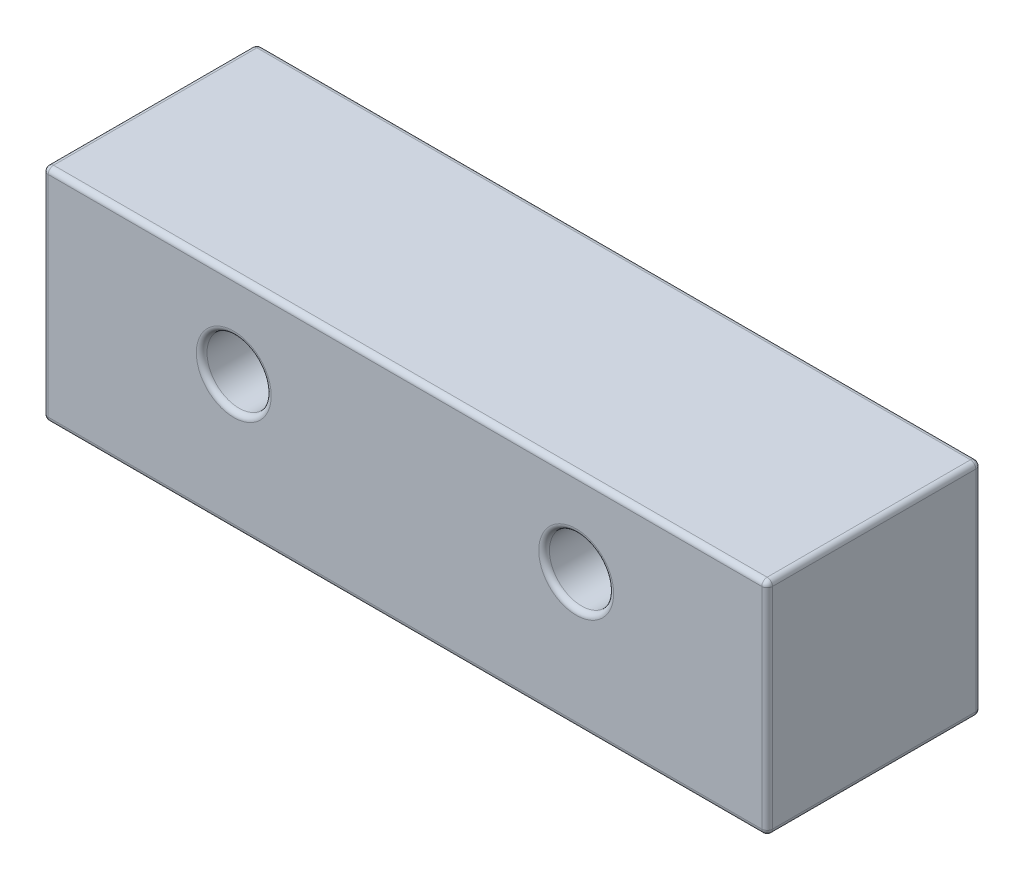
ISO-10303-21;
HEADER;
FILE_DESCRIPTION(('STEP AP214'),'2;1');
FILE_NAME('part.step','',(''),(''),'','','');
FILE_SCHEMA(('AUTOMOTIVE_DESIGN { 1 0 10303 214 1 1 1 1 }'));
ENDSEC;
DATA;
#1=APPLICATION_CONTEXT('core data for automotive mechanical design processes');
#2=APPLICATION_PROTOCOL_DEFINITION('international standard','automotive_design',2000,#1);
#3=PRODUCT_CONTEXT('',#1,'mechanical');
#4=PRODUCT('Part','Part','',(#3));
#5=PRODUCT_RELATED_PRODUCT_CATEGORY('part','',(#4));
#6=PRODUCT_DEFINITION_FORMATION('','',#4);
#7=PRODUCT_DEFINITION_CONTEXT('part definition',#1,'design');
#8=PRODUCT_DEFINITION('design','',#6,#7);
#9=PRODUCT_DEFINITION_SHAPE('','',#8);
#10=(LENGTH_UNIT() NAMED_UNIT(*) SI_UNIT(.MILLI.,.METRE.));
#11=(NAMED_UNIT(*) PLANE_ANGLE_UNIT() SI_UNIT($,.RADIAN.));
#12=(NAMED_UNIT(*) SI_UNIT($,.STERADIAN.) SOLID_ANGLE_UNIT());
#13=UNCERTAINTY_MEASURE_WITH_UNIT(LENGTH_MEASURE(1.E-05),#10,'distance_accuracy_value','');
#14=(GEOMETRIC_REPRESENTATION_CONTEXT(3) GLOBAL_UNCERTAINTY_ASSIGNED_CONTEXT((#13)) GLOBAL_UNIT_ASSIGNED_CONTEXT((#10,
#11,#12)) REPRESENTATION_CONTEXT('',''));
#15=CARTESIAN_POINT('',(0.,0.,0.));
#16=DIRECTION('',(0.,0.,1.));
#17=DIRECTION('',(1.,0.,0.));
#18=AXIS2_PLACEMENT_3D('',#15,#16,#17);
#19=CARTESIAN_POINT('',(0.,0.,20.));
#20=DIRECTION('',(0.,0.,-1.));
#21=DIRECTION('',(-1.,0.,0.));
#22=AXIS2_PLACEMENT_3D('',#19,#20,#21);
#23=PLANE('',#22);
#24=CARTESIAN_POINT('',(-17.8421373977874,12.6355262772669,20.));
#25=DIRECTION('',(0.,0.,-1.));
#26=DIRECTION('',(-1.,0.,0.));
#27=AXIS2_PLACEMENT_3D('',#24,#25,#26);
#28=CIRCLE('',#27,3.5);
#29=CARTESIAN_POINT('',(-21.3421373977874,12.6355262772669,20.));
#30=VERTEX_POINT('',#29);
#31=EDGE_CURVE('E220',#30,#30,#28,.T.);
#32=ORIENTED_EDGE('',*,*,#31,.T.);
#33=EDGE_LOOP('',(#32));
#34=FACE_BOUND('',#33,.T.);
#35=CARTESIAN_POINT('',(-49.8421373977874,12.6355262772669,20.));
#36=DIRECTION('',(0.,0.,-1.));
#37=DIRECTION('',(-1.,0.,0.));
#38=AXIS2_PLACEMENT_3D('',#35,#36,#37);
#39=CIRCLE('',#38,3.49999999999999);
#40=CARTESIAN_POINT('',(-53.3421373977874,12.6355262772669,20.));
#41=VERTEX_POINT('',#40);
#42=EDGE_CURVE('E217',#41,#41,#39,.T.);
#43=ORIENTED_EDGE('',*,*,#42,.T.);
#44=EDGE_LOOP('',(#43));
#45=FACE_BOUND('',#44,.T.);
#46=DIRECTION('',(0.,-1.,0.));
#47=VECTOR('',#46,1.);
#48=CARTESIAN_POINT('',(-67.1842747955748,0.,20.));
#49=LINE('',#48,#47);
#50=CARTESIAN_POINT('',(-67.1842747955748,20.1355262772669,20.));
#51=VERTEX_POINT('',#50);
#52=CARTESIAN_POINT('',(-67.1842747955748,0.5,20.));
#53=VERTEX_POINT('',#52);
#54=EDGE_CURVE('E212',#51,#53,#49,.T.);
#55=ORIENTED_EDGE('',*,*,#54,.T.);
#56=DIRECTION('',(1.,0.,0.));
#57=VECTOR('',#56,1.);
#58=CARTESIAN_POINT('',(0.,0.5,20.));
#59=LINE('',#58,#57);
#60=CARTESIAN_POINT('',(-0.5,0.5,20.));
#61=VERTEX_POINT('',#60);
#62=EDGE_CURVE('E215',#53,#61,#59,.T.);
#63=ORIENTED_EDGE('',*,*,#62,.T.);
#64=DIRECTION('',(0.,1.,0.));
#65=VECTOR('',#64,1.);
#66=CARTESIAN_POINT('',(-0.5,0.,20.));
#67=LINE('',#66,#65);
#68=CARTESIAN_POINT('',(-0.5,20.1355262772669,20.));
#69=VERTEX_POINT('',#68);
#70=EDGE_CURVE('E210',#61,#69,#67,.T.);
#71=ORIENTED_EDGE('',*,*,#70,.T.);
#72=DIRECTION('',(-1.,0.,0.));
#73=VECTOR('',#72,1.);
#74=CARTESIAN_POINT('',(0.,20.1355262772669,20.));
#75=LINE('',#74,#73);
#76=EDGE_CURVE('E208',#69,#51,#75,.T.);
#77=ORIENTED_EDGE('',*,*,#76,.T.);
#78=EDGE_LOOP('',(#55,#63,#71,#77));
#79=FACE_BOUND('',#78,.T.);
#80=ADVANCED_FACE('F33',(#34,#45,#79),#23,.F.);
#81=CARTESIAN_POINT('',(0.,0.,0.));
#82=DIRECTION('',(0.,0.,-1.));
#83=DIRECTION('',(-1.,0.,0.));
#84=AXIS2_PLACEMENT_3D('',#81,#82,#83);
#85=PLANE('',#84);
#86=CARTESIAN_POINT('',(-17.8421373977874,12.6355262772669,0.));
#87=DIRECTION('',(0.,0.,-1.));
#88=DIRECTION('',(-1.,0.,0.));
#89=AXIS2_PLACEMENT_3D('',#86,#87,#88);
#90=CIRCLE('',#89,3.5);
#91=CARTESIAN_POINT('',(-21.3421373977874,12.6355262772669,0.));
#92=VERTEX_POINT('',#91);
#93=EDGE_CURVE('E168',#92,#92,#90,.F.);
#94=ORIENTED_EDGE('',*,*,#93,.T.);
#95=EDGE_LOOP('',(#94));
#96=FACE_BOUND('',#95,.T.);
#97=CARTESIAN_POINT('',(-49.8421373977874,12.6355262772669,0.));
#98=DIRECTION('',(0.,0.,-1.));
#99=DIRECTION('',(-1.,0.,0.));
#100=AXIS2_PLACEMENT_3D('',#97,#98,#99);
#101=CIRCLE('',#100,3.49999999999999);
#102=CARTESIAN_POINT('',(-53.3421373977874,12.6355262772669,0.));
#103=VERTEX_POINT('',#102);
#104=EDGE_CURVE('E165',#103,#103,#101,.F.);
#105=ORIENTED_EDGE('',*,*,#104,.T.);
#106=EDGE_LOOP('',(#105));
#107=FACE_BOUND('',#106,.T.);
#108=DIRECTION('',(0.,1.,0.));
#109=VECTOR('',#108,1.);
#110=CARTESIAN_POINT('',(-0.5,0.,0.));
#111=LINE('',#110,#109);
#112=CARTESIAN_POINT('',(-0.5,20.1355262772669,0.));
#113=VERTEX_POINT('',#112);
#114=CARTESIAN_POINT('',(-0.5,0.5,0.));
#115=VERTEX_POINT('',#114);
#116=EDGE_CURVE('E133',#113,#115,#111,.F.);
#117=ORIENTED_EDGE('',*,*,#116,.T.);
#118=DIRECTION('',(1.,0.,0.));
#119=VECTOR('',#118,1.);
#120=CARTESIAN_POINT('',(-67.6842747955748,0.5,0.));
#121=LINE('',#120,#119);
#122=CARTESIAN_POINT('',(-67.1842747955748,0.5,0.));
#123=VERTEX_POINT('',#122);
#124=EDGE_CURVE('E129',#115,#123,#121,.F.);
#125=ORIENTED_EDGE('',*,*,#124,.T.);
#126=DIRECTION('',(0.,-1.,0.));
#127=VECTOR('',#126,1.);
#128=CARTESIAN_POINT('',(-67.1842747955748,20.6355262772669,0.));
#129=LINE('',#128,#127);
#130=CARTESIAN_POINT('',(-67.1842747955748,20.1355262772669,0.));
#131=VERTEX_POINT('',#130);
#132=EDGE_CURVE('E121',#123,#131,#129,.F.);
#133=ORIENTED_EDGE('',*,*,#132,.T.);
#134=DIRECTION('',(-1.,0.,0.));
#135=VECTOR('',#134,1.);
#136=CARTESIAN_POINT('',(0.,20.1355262772669,0.));
#137=LINE('',#136,#135);
#138=EDGE_CURVE('E126',#131,#113,#137,.F.);
#139=ORIENTED_EDGE('',*,*,#138,.T.);
#140=EDGE_LOOP('',(#117,#125,#133,#139));
#141=FACE_BOUND('',#140,.T.);
#142=ADVANCED_FACE('F124',(#96,#107,#141),#85,.T.);
#143=CARTESIAN_POINT('',(-67.6842747955748,0.,20.));
#144=DIRECTION('',(0.,1.,0.));
#145=DIRECTION('',(0.,0.,1.));
#146=AXIS2_PLACEMENT_3D('',#143,#144,#145);
#147=PLANE('',#146);
#148=DIRECTION('',(0.,0.,-1.));
#149=VECTOR('',#148,1.);
#150=CARTESIAN_POINT('',(-67.1842747955748,0.,20.));
#151=LINE('',#150,#149);
#152=CARTESIAN_POINT('',(-67.1842747955748,0.,19.5));
#153=VERTEX_POINT('',#152);
#154=CARTESIAN_POINT('',(-67.1842747955748,0.,0.5));
#155=VERTEX_POINT('',#154);
#156=EDGE_CURVE('E203',#153,#155,#151,.T.);
#157=ORIENTED_EDGE('',*,*,#156,.T.);
#158=DIRECTION('',(1.,0.,0.));
#159=VECTOR('',#158,1.);
#160=CARTESIAN_POINT('',(0.,0.,0.5));
#161=LINE('',#160,#159);
#162=CARTESIAN_POINT('',(-0.5,0.,0.5));
#163=VERTEX_POINT('',#162);
#164=EDGE_CURVE('E206',#155,#163,#161,.T.);
#165=ORIENTED_EDGE('',*,*,#164,.T.);
#166=DIRECTION('',(0.,0.,-1.));
#167=VECTOR('',#166,1.);
#168=CARTESIAN_POINT('',(-0.5,0.,20.));
#169=LINE('',#168,#167);
#170=CARTESIAN_POINT('',(-0.5,0.,19.5));
#171=VERTEX_POINT('',#170);
#172=EDGE_CURVE('E201',#163,#171,#169,.F.);
#173=ORIENTED_EDGE('',*,*,#172,.T.);
#174=DIRECTION('',(1.,0.,0.));
#175=VECTOR('',#174,1.);
#176=CARTESIAN_POINT('',(-67.6842747955748,0.,19.5));
#177=LINE('',#176,#175);
#178=EDGE_CURVE('E199',#171,#153,#177,.F.);
#179=ORIENTED_EDGE('',*,*,#178,.T.);
#180=EDGE_LOOP('',(#157,#165,#173,#179));
#181=FACE_BOUND('',#180,.T.);
#182=ADVANCED_FACE('F313',(#181),#147,.F.);
#183=CARTESIAN_POINT('',(0.,20.6355262772669,20.));
#184=DIRECTION('',(-1.,0.,0.));
#185=DIRECTION('',(0.,0.,1.));
#186=AXIS2_PLACEMENT_3D('',#183,#184,#185);
#187=PLANE('',#186);
#188=DIRECTION('',(0.,0.,-1.));
#189=VECTOR('',#188,1.);
#190=CARTESIAN_POINT('',(0.,0.5,20.));
#191=LINE('',#190,#189);
#192=CARTESIAN_POINT('',(0.,0.5,19.5));
#193=VERTEX_POINT('',#192);
#194=CARTESIAN_POINT('',(0.,0.5,0.5));
#195=VERTEX_POINT('',#194);
#196=EDGE_CURVE('E181',#193,#195,#191,.T.);
#197=ORIENTED_EDGE('',*,*,#196,.T.);
#198=DIRECTION('',(0.,1.,0.));
#199=VECTOR('',#198,1.);
#200=CARTESIAN_POINT('',(0.,20.6355262772669,0.5));
#201=LINE('',#200,#199);
#202=CARTESIAN_POINT('',(0.,20.1355262772669,0.5));
#203=VERTEX_POINT('',#202);
#204=EDGE_CURVE('E183',#195,#203,#201,.T.);
#205=ORIENTED_EDGE('',*,*,#204,.T.);
#206=DIRECTION('',(0.,0.,-1.));
#207=VECTOR('',#206,1.);
#208=CARTESIAN_POINT('',(0.,20.1355262772669,20.));
#209=LINE('',#208,#207);
#210=CARTESIAN_POINT('',(0.,20.1355262772669,19.5));
#211=VERTEX_POINT('',#210);
#212=EDGE_CURVE('E177',#203,#211,#209,.F.);
#213=ORIENTED_EDGE('',*,*,#212,.T.);
#214=DIRECTION('',(0.,1.,0.));
#215=VECTOR('',#214,1.);
#216=CARTESIAN_POINT('',(0.,20.6355262772669,19.5));
#217=LINE('',#216,#215);
#218=EDGE_CURVE('E179',#211,#193,#217,.F.);
#219=ORIENTED_EDGE('',*,*,#218,.T.);
#220=EDGE_LOOP('',(#197,#205,#213,#219));
#221=FACE_BOUND('',#220,.T.);
#222=ADVANCED_FACE('F327',(#221),#187,.F.);
#223=CARTESIAN_POINT('',(0.,20.6355262772669,20.));
#224=DIRECTION('',(0.,-1.,0.));
#225=DIRECTION('',(1.,0.,0.));
#226=AXIS2_PLACEMENT_3D('',#223,#224,#225);
#227=PLANE('',#226);
#228=DIRECTION('',(-1.,0.,0.));
#229=VECTOR('',#228,1.);
#230=CARTESIAN_POINT('',(0.,20.6355262772669,19.5));
#231=LINE('',#230,#229);
#232=CARTESIAN_POINT('',(-67.1842747955748,20.6355262772669,19.5));
#233=VERTEX_POINT('',#232);
#234=CARTESIAN_POINT('',(-0.5,20.6355262772669,19.5));
#235=VERTEX_POINT('',#234);
#236=EDGE_CURVE('E42',#233,#235,#231,.F.);
#237=ORIENTED_EDGE('',*,*,#236,.T.);
#238=DIRECTION('',(0.,0.,-1.));
#239=VECTOR('',#238,1.);
#240=CARTESIAN_POINT('',(-0.5,20.6355262772669,20.));
#241=LINE('',#240,#239);
#242=CARTESIAN_POINT('',(-0.5,20.6355262772669,0.5));
#243=VERTEX_POINT('',#242);
#244=EDGE_CURVE('E11',#235,#243,#241,.T.);
#245=ORIENTED_EDGE('',*,*,#244,.T.);
#246=DIRECTION('',(-1.,0.,0.));
#247=VECTOR('',#246,1.);
#248=CARTESIAN_POINT('',(-67.6842747955748,20.6355262772669,0.5));
#249=LINE('',#248,#247);
#250=CARTESIAN_POINT('',(-67.1842747955748,20.6355262772669,0.5));
#251=VERTEX_POINT('',#250);
#252=EDGE_CURVE('E223',#243,#251,#249,.T.);
#253=ORIENTED_EDGE('',*,*,#252,.T.);
#254=DIRECTION('',(0.,0.,-1.));
#255=VECTOR('',#254,1.);
#256=CARTESIAN_POINT('',(-67.1842747955748,20.6355262772669,20.));
#257=LINE('',#256,#255);
#258=EDGE_CURVE('E53',#251,#233,#257,.F.);
#259=ORIENTED_EDGE('',*,*,#258,.T.);
#260=EDGE_LOOP('',(#237,#245,#253,#259));
#261=FACE_BOUND('',#260,.T.);
#262=ADVANCED_FACE('F296',(#261),#227,.F.);
#263=CARTESIAN_POINT('',(-67.6842747955748,20.6355262772669,20.));
#264=DIRECTION('',(1.,0.,0.));
#265=DIRECTION('',(0.,0.,-1.));
#266=AXIS2_PLACEMENT_3D('',#263,#264,#265);
#267=PLANE('',#266);
#268=DIRECTION('',(0.,0.,-1.));
#269=VECTOR('',#268,1.);
#270=CARTESIAN_POINT('',(-67.6842747955748,20.1355262772669,20.));
#271=LINE('',#270,#269);
#272=CARTESIAN_POINT('',(-67.6842747955748,20.1355262772669,19.5));
#273=VERTEX_POINT('',#272);
#274=CARTESIAN_POINT('',(-67.6842747955748,20.1355262772669,0.5));
#275=VERTEX_POINT('',#274);
#276=EDGE_CURVE('E186',#273,#275,#271,.T.);
#277=ORIENTED_EDGE('',*,*,#276,.T.);
#278=DIRECTION('',(0.,-1.,0.));
#279=VECTOR('',#278,1.);
#280=CARTESIAN_POINT('',(-67.6842747955748,0.,0.5));
#281=LINE('',#280,#279);
#282=CARTESIAN_POINT('',(-67.6842747955748,0.5,0.5));
#283=VERTEX_POINT('',#282);
#284=EDGE_CURVE('E141',#275,#283,#281,.T.);
#285=ORIENTED_EDGE('',*,*,#284,.T.);
#286=DIRECTION('',(0.,0.,-1.));
#287=VECTOR('',#286,1.);
#288=CARTESIAN_POINT('',(-67.6842747955748,0.5,20.));
#289=LINE('',#288,#287);
#290=CARTESIAN_POINT('',(-67.6842747955748,0.5,19.5));
#291=VERTEX_POINT('',#290);
#292=EDGE_CURVE('E190',#283,#291,#289,.F.);
#293=ORIENTED_EDGE('',*,*,#292,.T.);
#294=DIRECTION('',(0.,-1.,0.));
#295=VECTOR('',#294,1.);
#296=CARTESIAN_POINT('',(-67.6842747955748,20.6355262772669,19.5));
#297=LINE('',#296,#295);
#298=EDGE_CURVE('E188',#291,#273,#297,.F.);
#299=ORIENTED_EDGE('',*,*,#298,.T.);
#300=EDGE_LOOP('',(#277,#285,#293,#299));
#301=FACE_BOUND('',#300,.T.);
#302=ADVANCED_FACE('F300',(#301),#267,.F.);
#303=CARTESIAN_POINT('',(-49.8421373977874,12.6355262772669,20.));
#304=DIRECTION('',(0.,0.,-1.));
#305=DIRECTION('',(-1.,0.,0.));
#306=AXIS2_PLACEMENT_3D('',#303,#304,#305);
#307=CYLINDRICAL_SURFACE('',#306,2.99999999999999);
#308=CARTESIAN_POINT('',(-49.8421373977874,12.6355262772669,0.5));
#309=DIRECTION('',(0.,0.,-1.));
#310=DIRECTION('',(-1.,0.,0.));
#311=AXIS2_PLACEMENT_3D('',#308,#309,#310);
#312=CIRCLE('',#311,2.99999999999999);
#313=CARTESIAN_POINT('',(-52.8421373977874,12.6355262772669,0.5));
#314=VERTEX_POINT('',#313);
#315=EDGE_CURVE('E196',#314,#314,#312,.T.);
#316=ORIENTED_EDGE('',*,*,#315,.T.);
#317=EDGE_LOOP('',(#316));
#318=FACE_BOUND('',#317,.T.);
#319=CARTESIAN_POINT('',(-49.8421373977874,12.6355262772669,19.5));
#320=DIRECTION('',(0.,0.,-1.));
#321=DIRECTION('',(-1.,0.,0.));
#322=AXIS2_PLACEMENT_3D('',#319,#320,#321);
#323=CIRCLE('',#322,2.99999999999999);
#324=CARTESIAN_POINT('',(-52.8421373977874,12.6355262772669,19.5));
#325=VERTEX_POINT('',#324);
#326=EDGE_CURVE('E193',#325,#325,#323,.F.);
#327=ORIENTED_EDGE('',*,*,#326,.T.);
#328=EDGE_LOOP('',(#327));
#329=FACE_BOUND('',#328,.T.);
#330=ADVANCED_FACE('F358',(#318,#329),#307,.F.);
#331=CARTESIAN_POINT('',(-17.8421373977874,12.6355262772669,20.));
#332=DIRECTION('',(0.,0.,-1.));
#333=DIRECTION('',(-1.,0.,0.));
#334=AXIS2_PLACEMENT_3D('',#331,#332,#333);
#335=CYLINDRICAL_SURFACE('',#334,3.);
#336=CARTESIAN_POINT('',(-17.8421373977874,12.6355262772669,0.5));
#337=DIRECTION('',(0.,0.,-1.));
#338=DIRECTION('',(-1.,0.,0.));
#339=AXIS2_PLACEMENT_3D('',#336,#337,#338);
#340=CIRCLE('',#339,3.);
#341=CARTESIAN_POINT('',(-20.8421373977874,12.6355262772669,0.5));
#342=VERTEX_POINT('',#341);
#343=EDGE_CURVE('E174',#342,#342,#340,.T.);
#344=ORIENTED_EDGE('',*,*,#343,.T.);
#345=EDGE_LOOP('',(#344));
#346=FACE_BOUND('',#345,.T.);
#347=CARTESIAN_POINT('',(-17.8421373977874,12.6355262772669,19.5));
#348=DIRECTION('',(0.,0.,-1.));
#349=DIRECTION('',(-1.,0.,0.));
#350=AXIS2_PLACEMENT_3D('',#347,#348,#349);
#351=CIRCLE('',#350,3.);
#352=CARTESIAN_POINT('',(-20.8421373977874,12.6355262772669,19.5));
#353=VERTEX_POINT('',#352);
#354=EDGE_CURVE('E171',#353,#353,#351,.F.);
#355=ORIENTED_EDGE('',*,*,#354,.T.);
#356=EDGE_LOOP('',(#355));
#357=FACE_BOUND('',#356,.T.);
#358=ADVANCED_FACE('F371',(#346,#357),#335,.F.);
#359=CARTESIAN_POINT('',(-17.8421373977874,12.6355262772669,0.5));
#360=DIRECTION('',(0.,0.,-1.));
#361=DIRECTION('',(-1.,0.,0.));
#362=AXIS2_PLACEMENT_3D('',#359,#360,#361);
#363=TOROIDAL_SURFACE('',#362,3.5,0.5);
#364=ORIENTED_EDGE('',*,*,#343,.F.);
#365=EDGE_LOOP('',(#364));
#366=FACE_BOUND('',#365,.T.);
#367=ORIENTED_EDGE('',*,*,#93,.F.);
#368=EDGE_LOOP('',(#367));
#369=FACE_BOUND('',#368,.T.);
#370=ADVANCED_FACE('F369',(#366,#369),#363,.T.);
#371=CARTESIAN_POINT('',(-67.1842747955748,0.,19.5));
#372=DIRECTION('',(0.,-1.,0.));
#373=DIRECTION('',(0.,0.,-1.));
#374=AXIS2_PLACEMENT_3D('',#371,#372,#373);
#375=CYLINDRICAL_SURFACE('',#374,0.5);
#376=CARTESIAN_POINT('',(-67.1842747955748,0.5,19.5));
#377=DIRECTION('',(0.,-1.,0.));
#378=DIRECTION('',(0.,0.,-1.));
#379=AXIS2_PLACEMENT_3D('',#376,#377,#378);
#380=CIRCLE('',#379,0.5);
#381=EDGE_CURVE('E37',#53,#291,#380,.T.);
#382=ORIENTED_EDGE('',*,*,#381,.F.);
#383=ORIENTED_EDGE('',*,*,#54,.F.);
#384=CARTESIAN_POINT('',(-67.1842747955748,20.1355262772669,19.5));
#385=DIRECTION('',(0.,1.,0.));
#386=DIRECTION('',(0.,0.,1.));
#387=AXIS2_PLACEMENT_3D('',#384,#385,#386);
#388=CIRCLE('',#387,0.5);
#389=EDGE_CURVE('E161',#273,#51,#388,.T.);
#390=ORIENTED_EDGE('',*,*,#389,.F.);
#391=ORIENTED_EDGE('',*,*,#298,.F.);
#392=EDGE_LOOP('',(#382,#383,#390,#391));
#393=FACE_BOUND('',#392,.T.);
#394=ADVANCED_FACE('F303',(#393),#375,.T.);
#395=CARTESIAN_POINT('',(-67.1842747955748,0.5,19.5));
#396=DIRECTION('',(0.,0.,1.));
#397=DIRECTION('',(1.,0.,0.));
#398=AXIS2_PLACEMENT_3D('',#395,#396,#397);
#399=SPHERICAL_SURFACE('',#398,0.5);
#400=CARTESIAN_POINT('',(-67.1842747955748,0.5,19.5));
#401=DIRECTION('',(-1.,0.,0.));
#402=DIRECTION('',(0.,0.,1.));
#403=AXIS2_PLACEMENT_3D('',#400,#401,#402);
#404=CIRCLE('',#403,0.5);
#405=EDGE_CURVE('E269',#53,#153,#404,.F.);
#406=ORIENTED_EDGE('',*,*,#405,.F.);
#407=ORIENTED_EDGE('',*,*,#381,.T.);
#408=CARTESIAN_POINT('',(-67.1842747955748,0.5,19.5));
#409=DIRECTION('',(0.,0.,1.));
#410=DIRECTION('',(1.,0.,0.));
#411=AXIS2_PLACEMENT_3D('',#408,#409,#410);
#412=CIRCLE('',#411,0.5);
#413=EDGE_CURVE('E272',#153,#291,#412,.F.);
#414=ORIENTED_EDGE('',*,*,#413,.F.);
#415=EDGE_LOOP('',(#406,#407,#414));
#416=FACE_BOUND('',#415,.T.);
#417=ADVANCED_FACE('F307',(#416),#399,.T.);
#418=CARTESIAN_POINT('',(-67.1842747955748,20.1355262772669,19.5));
#419=DIRECTION('',(0.,0.,1.));
#420=DIRECTION('',(1.,0.,0.));
#421=AXIS2_PLACEMENT_3D('',#418,#419,#420);
#422=SPHERICAL_SURFACE('',#421,0.5);
#423=CARTESIAN_POINT('',(-67.1842747955748,20.1355262772669,19.5));
#424=DIRECTION('',(0.,0.,1.));
#425=DIRECTION('',(1.,0.,0.));
#426=AXIS2_PLACEMENT_3D('',#423,#424,#425);
#427=CIRCLE('',#426,0.5);
#428=EDGE_CURVE('E264',#273,#233,#427,.F.);
#429=ORIENTED_EDGE('',*,*,#428,.F.);
#430=ORIENTED_EDGE('',*,*,#389,.T.);
#431=CARTESIAN_POINT('',(-67.1842747955748,20.1355262772669,19.5));
#432=DIRECTION('',(-1.,0.,0.));
#433=DIRECTION('',(0.,0.,1.));
#434=AXIS2_PLACEMENT_3D('',#431,#432,#433);
#435=CIRCLE('',#434,0.5);
#436=EDGE_CURVE('E266',#233,#51,#435,.F.);
#437=ORIENTED_EDGE('',*,*,#436,.F.);
#438=EDGE_LOOP('',(#429,#430,#437));
#439=FACE_BOUND('',#438,.T.);
#440=ADVANCED_FACE('F279',(#439),#422,.T.);
#441=CARTESIAN_POINT('',(-67.1842747955748,0.5,20.));
#442=DIRECTION('',(0.,0.,-1.));
#443=DIRECTION('',(-1.,0.,0.));
#444=AXIS2_PLACEMENT_3D('',#441,#442,#443);
#445=CYLINDRICAL_SURFACE('',#444,0.5);
#446=ORIENTED_EDGE('',*,*,#413,.T.);
#447=ORIENTED_EDGE('',*,*,#292,.F.);
#448=CARTESIAN_POINT('',(-67.1842747955748,0.5,0.5));
#449=DIRECTION('',(0.,0.,-1.));
#450=DIRECTION('',(-1.,0.,0.));
#451=AXIS2_PLACEMENT_3D('',#448,#449,#450);
#452=CIRCLE('',#451,0.5);
#453=EDGE_CURVE('E260',#155,#283,#452,.T.);
#454=ORIENTED_EDGE('',*,*,#453,.F.);
#455=ORIENTED_EDGE('',*,*,#156,.F.);
#456=EDGE_LOOP('',(#446,#447,#454,#455));
#457=FACE_BOUND('',#456,.T.);
#458=ADVANCED_FACE('F310',(#457),#445,.T.);
#459=CARTESIAN_POINT('',(0.,0.5,19.5));
#460=DIRECTION('',(1.,0.,0.));
#461=DIRECTION('',(0.,0.,-1.));
#462=AXIS2_PLACEMENT_3D('',#459,#460,#461);
#463=CYLINDRICAL_SURFACE('',#462,0.5);
#464=ORIENTED_EDGE('',*,*,#405,.T.);
#465=ORIENTED_EDGE('',*,*,#178,.F.);
#466=CARTESIAN_POINT('',(-0.5,0.5,19.5));
#467=DIRECTION('',(1.,0.,0.));
#468=DIRECTION('',(0.,0.,-1.));
#469=AXIS2_PLACEMENT_3D('',#466,#467,#468);
#470=CIRCLE('',#469,0.5);
#471=EDGE_CURVE('E257',#61,#171,#470,.T.);
#472=ORIENTED_EDGE('',*,*,#471,.F.);
#473=ORIENTED_EDGE('',*,*,#62,.F.);
#474=EDGE_LOOP('',(#464,#465,#472,#473));
#475=FACE_BOUND('',#474,.T.);
#476=ADVANCED_FACE('F318',(#475),#463,.T.);
#477=CARTESIAN_POINT('',(-0.5,0.,19.5));
#478=DIRECTION('',(0.,1.,0.));
#479=DIRECTION('',(0.,0.,1.));
#480=AXIS2_PLACEMENT_3D('',#477,#478,#479);
#481=CYLINDRICAL_SURFACE('',#480,0.5);
#482=CARTESIAN_POINT('',(-0.5,20.1355262772669,19.5));
#483=DIRECTION('',(0.,1.,0.));
#484=DIRECTION('',(0.,0.,1.));
#485=AXIS2_PLACEMENT_3D('',#482,#483,#484);
#486=CIRCLE('',#485,0.5);
#487=EDGE_CURVE('E251',#69,#211,#486,.T.);
#488=ORIENTED_EDGE('',*,*,#487,.F.);
#489=ORIENTED_EDGE('',*,*,#70,.F.);
#490=CARTESIAN_POINT('',(-0.5,0.5,19.5));
#491=DIRECTION('',(0.,-1.,0.));
#492=DIRECTION('',(0.,0.,-1.));
#493=AXIS2_PLACEMENT_3D('',#490,#491,#492);
#494=CIRCLE('',#493,0.5);
#495=EDGE_CURVE('E254',#193,#61,#494,.T.);
#496=ORIENTED_EDGE('',*,*,#495,.F.);
#497=ORIENTED_EDGE('',*,*,#218,.F.);
#498=EDGE_LOOP('',(#488,#489,#496,#497));
#499=FACE_BOUND('',#498,.T.);
#500=ADVANCED_FACE('F323',(#499),#481,.T.);
#501=CARTESIAN_POINT('',(0.,20.1355262772669,19.5));
#502=DIRECTION('',(-1.,0.,0.));
#503=DIRECTION('',(0.,-1.,0.));
#504=AXIS2_PLACEMENT_3D('',#501,#502,#503);
#505=CYLINDRICAL_SURFACE('',#504,0.5);
#506=ORIENTED_EDGE('',*,*,#436,.T.);
#507=ORIENTED_EDGE('',*,*,#76,.F.);
#508=CARTESIAN_POINT('',(-0.5,20.1355262772669,19.5));
#509=DIRECTION('',(1.,0.,0.));
#510=DIRECTION('',(0.,0.,-1.));
#511=AXIS2_PLACEMENT_3D('',#508,#509,#510);
#512=CIRCLE('',#511,0.5);
#513=EDGE_CURVE('E248',#235,#69,#512,.T.);
#514=ORIENTED_EDGE('',*,*,#513,.F.);
#515=ORIENTED_EDGE('',*,*,#236,.F.);
#516=EDGE_LOOP('',(#506,#507,#514,#515));
#517=FACE_BOUND('',#516,.T.);
#518=ADVANCED_FACE('F286',(#517),#505,.T.);
#519=CARTESIAN_POINT('',(-67.1842747955748,20.1355262772669,20.));
#520=DIRECTION('',(0.,0.,-1.));
#521=DIRECTION('',(-1.,0.,0.));
#522=AXIS2_PLACEMENT_3D('',#519,#520,#521);
#523=CYLINDRICAL_SURFACE('',#522,0.5);
#524=ORIENTED_EDGE('',*,*,#428,.T.);
#525=ORIENTED_EDGE('',*,*,#258,.F.);
#526=CARTESIAN_POINT('',(-67.1842747955748,20.1355262772669,0.5));
#527=DIRECTION('',(0.,0.,-1.));
#528=DIRECTION('',(-1.,0.,0.));
#529=AXIS2_PLACEMENT_3D('',#526,#527,#528);
#530=CIRCLE('',#529,0.5);
#531=EDGE_CURVE('E145',#275,#251,#530,.T.);
#532=ORIENTED_EDGE('',*,*,#531,.F.);
#533=ORIENTED_EDGE('',*,*,#276,.F.);
#534=EDGE_LOOP('',(#524,#525,#532,#533));
#535=FACE_BOUND('',#534,.T.);
#536=ADVANCED_FACE('F298',(#535),#523,.T.);
#537=CARTESIAN_POINT('',(-67.1842747955748,20.6355262772669,0.5));
#538=DIRECTION('',(0.,1.,0.));
#539=DIRECTION('',(0.,0.,1.));
#540=AXIS2_PLACEMENT_3D('',#537,#538,#539);
#541=CYLINDRICAL_SURFACE('',#540,0.5);
#542=CARTESIAN_POINT('',(-67.1842747955748,0.5,0.5));
#543=DIRECTION('',(0.,-1.,0.));
#544=DIRECTION('',(0.,0.,-1.));
#545=AXIS2_PLACEMENT_3D('',#542,#543,#544);
#546=CIRCLE('',#545,0.5);
#547=EDGE_CURVE('E262',#283,#123,#546,.T.);
#548=ORIENTED_EDGE('',*,*,#547,.F.);
#549=ORIENTED_EDGE('',*,*,#284,.F.);
#550=CARTESIAN_POINT('',(-67.1842747955748,20.1355262772669,0.5));
#551=DIRECTION('',(0.,1.,0.));
#552=DIRECTION('',(0.,0.,1.));
#553=AXIS2_PLACEMENT_3D('',#550,#551,#552);
#554=CIRCLE('',#553,0.5);
#555=EDGE_CURVE('E137',#131,#275,#554,.T.);
#556=ORIENTED_EDGE('',*,*,#555,.F.);
#557=ORIENTED_EDGE('',*,*,#132,.F.);
#558=EDGE_LOOP('',(#548,#549,#556,#557));
#559=FACE_BOUND('',#558,.T.);
#560=ADVANCED_FACE('F139',(#559),#541,.T.);
#561=CARTESIAN_POINT('',(-67.1842747955748,0.5,0.5));
#562=DIRECTION('',(0.,0.,1.));
#563=DIRECTION('',(1.,0.,0.));
#564=AXIS2_PLACEMENT_3D('',#561,#562,#563);
#565=SPHERICAL_SURFACE('',#564,0.5);
#566=ORIENTED_EDGE('',*,*,#453,.T.);
#567=ORIENTED_EDGE('',*,*,#547,.T.);
#568=CARTESIAN_POINT('',(-67.1842747955748,0.5,0.5));
#569=DIRECTION('',(-1.,0.,0.));
#570=DIRECTION('',(0.,0.,1.));
#571=AXIS2_PLACEMENT_3D('',#568,#569,#570);
#572=CIRCLE('',#571,0.5);
#573=EDGE_CURVE('E146',#155,#123,#572,.F.);
#574=ORIENTED_EDGE('',*,*,#573,.F.);
#575=EDGE_LOOP('',(#566,#567,#574));
#576=FACE_BOUND('',#575,.T.);
#577=ADVANCED_FACE('F411',(#576),#565,.T.);
#578=CARTESIAN_POINT('',(-0.5,0.5,19.5));
#579=DIRECTION('',(0.,0.,1.));
#580=DIRECTION('',(1.,0.,0.));
#581=AXIS2_PLACEMENT_3D('',#578,#579,#580);
#582=SPHERICAL_SURFACE('',#581,0.5);
#583=ORIENTED_EDGE('',*,*,#495,.T.);
#584=ORIENTED_EDGE('',*,*,#471,.T.);
#585=CARTESIAN_POINT('',(-0.5,0.5,19.5));
#586=DIRECTION('',(0.,0.,1.));
#587=DIRECTION('',(1.,0.,0.));
#588=AXIS2_PLACEMENT_3D('',#585,#586,#587);
#589=CIRCLE('',#588,0.5);
#590=EDGE_CURVE('E242',#193,#171,#589,.F.);
#591=ORIENTED_EDGE('',*,*,#590,.F.);
#592=EDGE_LOOP('',(#583,#584,#591));
#593=FACE_BOUND('',#592,.T.);
#594=ADVANCED_FACE('F414',(#593),#582,.T.);
#595=CARTESIAN_POINT('',(-0.5,20.1355262772669,19.5));
#596=DIRECTION('',(0.,0.,1.));
#597=DIRECTION('',(1.,0.,0.));
#598=AXIS2_PLACEMENT_3D('',#595,#596,#597);
#599=SPHERICAL_SURFACE('',#598,0.5);
#600=ORIENTED_EDGE('',*,*,#513,.T.);
#601=ORIENTED_EDGE('',*,*,#487,.T.);
#602=CARTESIAN_POINT('',(-0.5,20.1355262772669,19.5));
#603=DIRECTION('',(0.,0.,1.));
#604=DIRECTION('',(1.,0.,0.));
#605=AXIS2_PLACEMENT_3D('',#602,#603,#604);
#606=CIRCLE('',#605,0.5);
#607=EDGE_CURVE('E153',#235,#211,#606,.F.);
#608=ORIENTED_EDGE('',*,*,#607,.F.);
#609=EDGE_LOOP('',(#600,#601,#608));
#610=FACE_BOUND('',#609,.T.);
#611=ADVANCED_FACE('F291',(#610),#599,.T.);
#612=CARTESIAN_POINT('',(-67.1842747955748,20.1355262772669,0.5));
#613=DIRECTION('',(0.,0.,1.));
#614=DIRECTION('',(1.,0.,0.));
#615=AXIS2_PLACEMENT_3D('',#612,#613,#614);
#616=SPHERICAL_SURFACE('',#615,0.5);
#617=ORIENTED_EDGE('',*,*,#555,.T.);
#618=ORIENTED_EDGE('',*,*,#531,.T.);
#619=CARTESIAN_POINT('',(-67.1842747955748,20.1355262772669,0.5));
#620=DIRECTION('',(-1.,0.,0.));
#621=DIRECTION('',(0.,0.,1.));
#622=AXIS2_PLACEMENT_3D('',#619,#620,#621);
#623=CIRCLE('',#622,0.5);
#624=EDGE_CURVE('E149',#131,#251,#623,.F.);
#625=ORIENTED_EDGE('',*,*,#624,.F.);
#626=EDGE_LOOP('',(#617,#618,#625));
#627=FACE_BOUND('',#626,.T.);
#628=ADVANCED_FACE('F150',(#627),#616,.T.);
#629=CARTESIAN_POINT('',(-67.6842747955748,0.5,0.5));
#630=DIRECTION('',(-1.,0.,0.));
#631=DIRECTION('',(0.,0.,1.));
#632=AXIS2_PLACEMENT_3D('',#629,#630,#631);
#633=CYLINDRICAL_SURFACE('',#632,0.5);
#634=ORIENTED_EDGE('',*,*,#573,.T.);
#635=ORIENTED_EDGE('',*,*,#124,.F.);
#636=CARTESIAN_POINT('',(-0.5,0.5,0.5));
#637=DIRECTION('',(1.,0.,0.));
#638=DIRECTION('',(0.,0.,-1.));
#639=AXIS2_PLACEMENT_3D('',#636,#637,#638);
#640=CIRCLE('',#639,0.5);
#641=EDGE_CURVE('E154',#163,#115,#640,.T.);
#642=ORIENTED_EDGE('',*,*,#641,.F.);
#643=ORIENTED_EDGE('',*,*,#164,.F.);
#644=EDGE_LOOP('',(#634,#635,#642,#643));
#645=FACE_BOUND('',#644,.T.);
#646=ADVANCED_FACE('F423',(#645),#633,.T.);
#647=CARTESIAN_POINT('',(-0.5,0.5,20.));
#648=DIRECTION('',(0.,0.,-1.));
#649=DIRECTION('',(-1.,0.,0.));
#650=AXIS2_PLACEMENT_3D('',#647,#648,#649);
#651=CYLINDRICAL_SURFACE('',#650,0.5);
#652=ORIENTED_EDGE('',*,*,#590,.T.);
#653=ORIENTED_EDGE('',*,*,#172,.F.);
#654=CARTESIAN_POINT('',(-0.5,0.5,0.5));
#655=DIRECTION('',(0.,0.,-1.));
#656=DIRECTION('',(-1.,0.,0.));
#657=AXIS2_PLACEMENT_3D('',#654,#655,#656);
#658=CIRCLE('',#657,0.5);
#659=EDGE_CURVE('E235',#195,#163,#658,.T.);
#660=ORIENTED_EDGE('',*,*,#659,.F.);
#661=ORIENTED_EDGE('',*,*,#196,.F.);
#662=EDGE_LOOP('',(#652,#653,#660,#661));
#663=FACE_BOUND('',#662,.T.);
#664=ADVANCED_FACE('F426',(#663),#651,.T.);
#665=CARTESIAN_POINT('',(-0.5,20.1355262772669,20.));
#666=DIRECTION('',(0.,0.,-1.));
#667=DIRECTION('',(-1.,0.,0.));
#668=AXIS2_PLACEMENT_3D('',#665,#666,#667);
#669=CYLINDRICAL_SURFACE('',#668,0.5);
#670=ORIENTED_EDGE('',*,*,#607,.T.);
#671=ORIENTED_EDGE('',*,*,#212,.F.);
#672=CARTESIAN_POINT('',(-0.5,20.1355262772669,0.5));
#673=DIRECTION('',(0.,0.,-1.));
#674=DIRECTION('',(-1.,0.,0.));
#675=AXIS2_PLACEMENT_3D('',#672,#673,#674);
#676=CIRCLE('',#675,0.5);
#677=EDGE_CURVE('E232',#243,#203,#676,.T.);
#678=ORIENTED_EDGE('',*,*,#677,.F.);
#679=ORIENTED_EDGE('',*,*,#244,.F.);
#680=EDGE_LOOP('',(#670,#671,#678,#679));
#681=FACE_BOUND('',#680,.T.);
#682=ADVANCED_FACE('F295',(#681),#669,.T.);
#683=CARTESIAN_POINT('',(0.,20.1355262772669,0.5));
#684=DIRECTION('',(1.,0.,0.));
#685=DIRECTION('',(0.,1.,0.));
#686=AXIS2_PLACEMENT_3D('',#683,#684,#685);
#687=CYLINDRICAL_SURFACE('',#686,0.5);
#688=ORIENTED_EDGE('',*,*,#624,.T.);
#689=ORIENTED_EDGE('',*,*,#252,.F.);
#690=CARTESIAN_POINT('',(-0.5,20.1355262772669,0.5));
#691=DIRECTION('',(1.,0.,0.));
#692=DIRECTION('',(0.,0.,-1.));
#693=AXIS2_PLACEMENT_3D('',#690,#691,#692);
#694=CIRCLE('',#693,0.5);
#695=EDGE_CURVE('E157',#113,#243,#694,.T.);
#696=ORIENTED_EDGE('',*,*,#695,.F.);
#697=ORIENTED_EDGE('',*,*,#138,.F.);
#698=EDGE_LOOP('',(#688,#689,#696,#697));
#699=FACE_BOUND('',#698,.T.);
#700=ADVANCED_FACE('F156',(#699),#687,.T.);
#701=CARTESIAN_POINT('',(-0.5,0.5,0.5));
#702=DIRECTION('',(0.,0.,1.));
#703=DIRECTION('',(1.,0.,0.));
#704=AXIS2_PLACEMENT_3D('',#701,#702,#703);
#705=SPHERICAL_SURFACE('',#704,0.5);
#706=ORIENTED_EDGE('',*,*,#659,.T.);
#707=ORIENTED_EDGE('',*,*,#641,.T.);
#708=CARTESIAN_POINT('',(-0.5,0.5,0.5));
#709=DIRECTION('',(0.,-1.,0.));
#710=DIRECTION('',(1.,0.,0.));
#711=AXIS2_PLACEMENT_3D('',#708,#709,#710);
#712=CIRCLE('',#711,0.5);
#713=EDGE_CURVE('E229',#195,#115,#712,.F.);
#714=ORIENTED_EDGE('',*,*,#713,.F.);
#715=EDGE_LOOP('',(#706,#707,#714));
#716=FACE_BOUND('',#715,.T.);
#717=ADVANCED_FACE('F338',(#716),#705,.T.);
#718=CARTESIAN_POINT('',(-0.5,20.1355262772669,0.5));
#719=DIRECTION('',(0.,0.,1.));
#720=DIRECTION('',(1.,0.,0.));
#721=AXIS2_PLACEMENT_3D('',#718,#719,#720);
#722=SPHERICAL_SURFACE('',#721,0.5);
#723=ORIENTED_EDGE('',*,*,#695,.T.);
#724=ORIENTED_EDGE('',*,*,#677,.T.);
#725=CARTESIAN_POINT('',(-0.5,20.1355262772669,0.5));
#726=DIRECTION('',(0.,1.,0.));
#727=DIRECTION('',(0.,0.,1.));
#728=AXIS2_PLACEMENT_3D('',#725,#726,#727);
#729=CIRCLE('',#728,0.5);
#730=EDGE_CURVE('E227',#113,#203,#729,.F.);
#731=ORIENTED_EDGE('',*,*,#730,.F.);
#732=EDGE_LOOP('',(#723,#724,#731));
#733=FACE_BOUND('',#732,.T.);
#734=ADVANCED_FACE('F336',(#733),#722,.T.);
#735=CARTESIAN_POINT('',(-0.5,20.6355262772669,0.5));
#736=DIRECTION('',(0.,-1.,0.));
#737=DIRECTION('',(0.,0.,-1.));
#738=AXIS2_PLACEMENT_3D('',#735,#736,#737);
#739=CYLINDRICAL_SURFACE('',#738,0.5);
#740=ORIENTED_EDGE('',*,*,#713,.T.);
#741=ORIENTED_EDGE('',*,*,#116,.F.);
#742=ORIENTED_EDGE('',*,*,#730,.T.);
#743=ORIENTED_EDGE('',*,*,#204,.F.);
#744=EDGE_LOOP('',(#740,#741,#742,#743));
#745=FACE_BOUND('',#744,.T.);
#746=ADVANCED_FACE('F332',(#745),#739,.T.);
#747=CARTESIAN_POINT('',(-49.8421373977874,12.6355262772669,0.5));
#748=DIRECTION('',(0.,0.,-1.));
#749=DIRECTION('',(-1.,0.,0.));
#750=AXIS2_PLACEMENT_3D('',#747,#748,#749);
#751=TOROIDAL_SURFACE('',#750,3.49999999999999,0.5);
#752=ORIENTED_EDGE('',*,*,#315,.F.);
#753=EDGE_LOOP('',(#752));
#754=FACE_BOUND('',#753,.T.);
#755=ORIENTED_EDGE('',*,*,#104,.F.);
#756=EDGE_LOOP('',(#755));
#757=FACE_BOUND('',#756,.T.);
#758=ADVANCED_FACE('F344',(#754,#757),#751,.T.);
#759=CARTESIAN_POINT('',(-17.8421373977874,12.6355262772669,19.5));
#760=DIRECTION('',(0.,0.,-1.));
#761=DIRECTION('',(-1.,0.,0.));
#762=AXIS2_PLACEMENT_3D('',#759,#760,#761);
#763=TOROIDAL_SURFACE('',#762,3.5,0.5);
#764=ORIENTED_EDGE('',*,*,#31,.F.);
#765=EDGE_LOOP('',(#764));
#766=FACE_BOUND('',#765,.T.);
#767=ORIENTED_EDGE('',*,*,#354,.F.);
#768=EDGE_LOOP('',(#767));
#769=FACE_BOUND('',#768,.T.);
#770=ADVANCED_FACE('F386',(#766,#769),#763,.T.);
#771=CARTESIAN_POINT('',(-49.8421373977874,12.6355262772669,19.5));
#772=DIRECTION('',(0.,0.,-1.));
#773=DIRECTION('',(-1.,0.,0.));
#774=AXIS2_PLACEMENT_3D('',#771,#772,#773);
#775=TOROIDAL_SURFACE('',#774,3.49999999999999,0.5);
#776=ORIENTED_EDGE('',*,*,#42,.F.);
#777=EDGE_LOOP('',(#776));
#778=FACE_BOUND('',#777,.T.);
#779=ORIENTED_EDGE('',*,*,#326,.F.);
#780=EDGE_LOOP('',(#779));
#781=FACE_BOUND('',#780,.T.);
#782=ADVANCED_FACE('F35',(#778,#781),#775,.T.);
#783=CLOSED_SHELL('',(#80,#142,#182,#222,#262,#302,#330,#358,#370,#394,#417,#440,#458,#476,#500,
#518,#536,#560,#577,#594,#611,#628,#646,#664,#682,#700,#717,#734,#746,#758,#770,#782));
#784=MANIFOLD_SOLID_BREP('B2',#783);
#785=ADVANCED_BREP_SHAPE_REPRESENTATION('',(#18,#784),#14);
#786=SHAPE_DEFINITION_REPRESENTATION(#9,#785);
ENDSEC;
END-ISO-10303-21;
